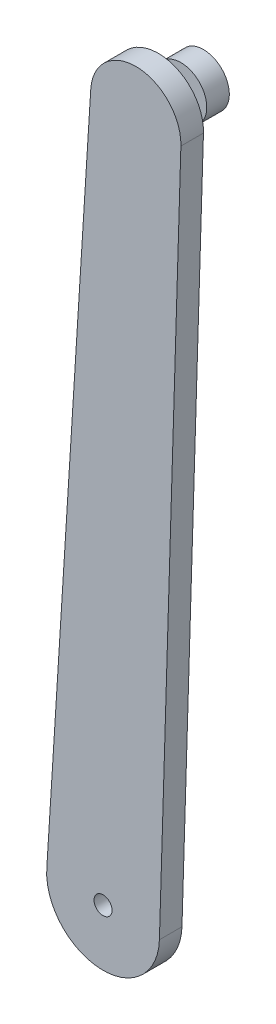
ISO-10303-21;
HEADER;
FILE_DESCRIPTION(('STEP AP214'),'2;1');
FILE_NAME('part.step','',(''),(''),'','','');
FILE_SCHEMA(('AUTOMOTIVE_DESIGN { 1 0 10303 214 1 1 1 1 }'));
ENDSEC;
DATA;
#1=APPLICATION_CONTEXT('core data for automotive mechanical design processes');
#2=APPLICATION_PROTOCOL_DEFINITION('international standard','automotive_design',2000,#1);
#3=PRODUCT_CONTEXT('',#1,'mechanical');
#4=PRODUCT('Part','Part','',(#3));
#5=PRODUCT_RELATED_PRODUCT_CATEGORY('part','',(#4));
#6=PRODUCT_DEFINITION_FORMATION('','',#4);
#7=PRODUCT_DEFINITION_CONTEXT('part definition',#1,'design');
#8=PRODUCT_DEFINITION('design','',#6,#7);
#9=PRODUCT_DEFINITION_SHAPE('','',#8);
#10=(LENGTH_UNIT() NAMED_UNIT(*) SI_UNIT(.MILLI.,.METRE.));
#11=(NAMED_UNIT(*) PLANE_ANGLE_UNIT() SI_UNIT($,.RADIAN.));
#12=(NAMED_UNIT(*) SI_UNIT($,.STERADIAN.) SOLID_ANGLE_UNIT());
#13=UNCERTAINTY_MEASURE_WITH_UNIT(LENGTH_MEASURE(1.E-05),#10,'distance_accuracy_value','');
#14=(GEOMETRIC_REPRESENTATION_CONTEXT(3) GLOBAL_UNCERTAINTY_ASSIGNED_CONTEXT((#13)) GLOBAL_UNIT_ASSIGNED_CONTEXT((#10,
#11,#12)) REPRESENTATION_CONTEXT('',''));
#15=CARTESIAN_POINT('',(0.,0.,0.));
#16=DIRECTION('',(0.,0.,1.));
#17=DIRECTION('',(1.,0.,0.));
#18=AXIS2_PLACEMENT_3D('',#15,#16,#17);
#19=CARTESIAN_POINT('',(15.5416799993005,-0.981251632451746,260.964116371449));
#20=DIRECTION('',(0.998012812603553,-0.0630113154849549,-1.64737168290973E-12));
#21=DIRECTION('',(0.0630113154849549,0.998012812603553,0.));
#22=AXIS2_PLACEMENT_3D('',#19,#20,#21);
#23=PLANE('',#22);
#24=DIRECTION('',(-0.0630113154849549,-0.998012812603553,1.04018967755278E-13));
#25=VECTOR('',#24,1.);
#26=CARTESIAN_POINT('',(15.5416799992963,-0.981251632451746,258.424116371449));
#27=LINE('',#26,#25);
#28=CARTESIAN_POINT('',(20.5840949122731,78.8836845442195,258.424116371441));
#29=VERTEX_POINT('',#28);
#30=CARTESIAN_POINT('',(15.6288954733021,0.400121853329466,258.424116371449));
#31=VERTEX_POINT('',#30);
#32=EDGE_CURVE('E115',#29,#31,#27,.T.);
#33=ORIENTED_EDGE('',*,*,#32,.T.);
#34=DIRECTION('',(-1.65065183743707E-12,0.,-1.));
#35=VECTOR('',#34,1.);
#36=CARTESIAN_POINT('',(15.6288954733063,0.400121853329466,260.964116371449));
#37=LINE('',#36,#35);
#38=CARTESIAN_POINT('',(15.6288954733063,0.400121853329466,260.964116371449));
#39=VERTEX_POINT('',#38);
#40=EDGE_CURVE('E48',#39,#31,#37,.T.);
#41=ORIENTED_EDGE('',*,*,#40,.F.);
#42=DIRECTION('',(-0.0630113154849549,-0.998012812603553,1.04018967755278E-13));
#43=VECTOR('',#42,1.);
#44=CARTESIAN_POINT('',(15.5416799993005,-0.981251632451746,260.964116371449));
#45=LINE('',#44,#43);
#46=CARTESIAN_POINT('',(20.5840949122772,78.8836845442195,260.964116371441));
#47=VERTEX_POINT('',#46);
#48=EDGE_CURVE('E99',#47,#39,#45,.T.);
#49=ORIENTED_EDGE('',*,*,#48,.F.);
#50=DIRECTION('',(-1.65065183743707E-12,0.,-1.));
#51=VECTOR('',#50,1.);
#52=CARTESIAN_POINT('',(20.5840949122772,78.8836845442195,260.964116371441));
#53=LINE('',#52,#51);
#54=EDGE_CURVE('E114',#47,#29,#53,.T.);
#55=ORIENTED_EDGE('',*,*,#54,.T.);
#56=EDGE_LOOP('',(#33,#41,#49,#55));
#57=FACE_BOUND('',#56,.T.);
#58=ADVANCED_FACE('F45',(#57),#23,.F.);
#59=CARTESIAN_POINT('',(21.9662768333389,0.,260.964116371438));
#60=DIRECTION('',(-1.65065183743707E-12,0.,-1.));
#61=DIRECTION('',(-1.,0.,1.65065183743707E-12));
#62=AXIS2_PLACEMENT_3D('',#59,#60,#61);
#63=CYLINDRICAL_SURFACE('',#62,6.35);
#64=CARTESIAN_POINT('',(21.9662768333347,0.,258.424116371438));
#65=DIRECTION('',(1.65079822496507E-12,0.,1.));
#66=DIRECTION('',(1.,0.,-1.65079822496507E-12));
#67=AXIS2_PLACEMENT_3D('',#64,#65,#66);
#68=CIRCLE('',#67,6.35);
#69=CARTESIAN_POINT('',(28.3132735924849,-0.195274523009568,258.424116371428));
#70=VERTEX_POINT('',#69);
#71=EDGE_CURVE('E104',#31,#70,#68,.T.);
#72=ORIENTED_EDGE('',*,*,#71,.T.);
#73=DIRECTION('',(-1.65065183743707E-12,0.,-1.));
#74=VECTOR('',#73,1.);
#75=CARTESIAN_POINT('',(28.3132735924891,-0.195274523009568,260.964116371428));
#76=LINE('',#75,#74);
#77=CARTESIAN_POINT('',(28.3132735924891,-0.195274523009568,260.964116371428));
#78=VERTEX_POINT('',#77);
#79=EDGE_CURVE('E102',#78,#70,#76,.T.);
#80=ORIENTED_EDGE('',*,*,#79,.F.);
#81=CARTESIAN_POINT('',(21.9662768333389,0.,260.964116371438));
#82=DIRECTION('',(1.65079822496507E-12,0.,1.));
#83=DIRECTION('',(1.,0.,-1.65079822496507E-12));
#84=AXIS2_PLACEMENT_3D('',#81,#82,#83);
#85=CIRCLE('',#84,6.35);
#86=EDGE_CURVE('E93',#39,#78,#85,.T.);
#87=ORIENTED_EDGE('',*,*,#86,.F.);
#88=ORIENTED_EDGE('',*,*,#40,.T.);
#89=EDGE_LOOP('',(#72,#80,#87,#88));
#90=FACE_BOUND('',#89,.T.);
#91=ADVANCED_FACE('F103',(#90),#63,.T.);
#92=CARTESIAN_POINT('',(28.2925005469463,-0.870459645501462,260.964116371428));
#93=DIRECTION('',(-0.999527048685074,0.030751893387334,1.64987115948004E-12));
#94=DIRECTION('',(-0.030751893387334,-0.999527048685074,0.));
#95=AXIS2_PLACEMENT_3D('',#92,#93,#94);
#96=PLANE('',#95);
#97=DIRECTION('',(0.030751893387334,0.999527048685074,0.));
#98=VECTOR('',#97,1.);
#99=CARTESIAN_POINT('',(28.2925005469421,-0.870459645501462,258.424116371428));
#100=LINE('',#99,#98);
#101=CARTESIAN_POINT('',(30.7315974076193,78.4073674431483,258.424116371424));
#102=VERTEX_POINT('',#101);
#103=EDGE_CURVE('E79',#70,#102,#100,.T.);
#104=ORIENTED_EDGE('',*,*,#103,.T.);
#105=DIRECTION('',(-1.65065183743707E-12,0.,-1.));
#106=VECTOR('',#105,1.);
#107=CARTESIAN_POINT('',(30.7315974076235,78.4073674431483,260.964116371424));
#108=LINE('',#107,#106);
#109=CARTESIAN_POINT('',(30.7315974076235,78.4073674431483,260.964116371424));
#110=VERTEX_POINT('',#109);
#111=EDGE_CURVE('E105',#110,#102,#108,.T.);
#112=ORIENTED_EDGE('',*,*,#111,.F.);
#113=DIRECTION('',(0.030751893387334,0.999527048685074,0.));
#114=VECTOR('',#113,1.);
#115=CARTESIAN_POINT('',(28.2925005469463,-0.870459645501462,260.964116371428));
#116=LINE('',#115,#114);
#117=EDGE_CURVE('E97',#78,#110,#116,.T.);
#118=ORIENTED_EDGE('',*,*,#117,.F.);
#119=ORIENTED_EDGE('',*,*,#79,.T.);
#120=EDGE_LOOP('',(#104,#112,#118,#119));
#121=FACE_BOUND('',#120,.T.);
#122=ADVANCED_FACE('F106',(#121),#96,.F.);
#123=CARTESIAN_POINT('',(25.6540000003033,78.5635870615559,260.964116371432));
#124=DIRECTION('',(-1.65065183743707E-12,0.,-1.));
#125=DIRECTION('',(-1.,0.,1.65065183743707E-12));
#126=AXIS2_PLACEMENT_3D('',#123,#124,#125);
#127=CYLINDRICAL_SURFACE('',#126,5.08);
#128=CARTESIAN_POINT('',(25.6540000002991,78.5635870615559,258.424116371432));
#129=DIRECTION('',(1.65079822496507E-12,0.,1.));
#130=DIRECTION('',(1.,0.,-1.65079822496507E-12));
#131=AXIS2_PLACEMENT_3D('',#128,#129,#130);
#132=CIRCLE('',#131,5.08);
#133=EDGE_CURVE('E85',#102,#29,#132,.T.);
#134=ORIENTED_EDGE('',*,*,#133,.T.);
#135=ORIENTED_EDGE('',*,*,#54,.F.);
#136=CARTESIAN_POINT('',(25.6540000003033,78.5635870615559,260.964116371432));
#137=DIRECTION('',(1.65079822496507E-12,0.,1.));
#138=DIRECTION('',(1.,0.,-1.65079822496507E-12));
#139=AXIS2_PLACEMENT_3D('',#136,#137,#138);
#140=CIRCLE('',#139,5.08);
#141=EDGE_CURVE('E62',#110,#47,#140,.T.);
#142=ORIENTED_EDGE('',*,*,#141,.F.);
#143=ORIENTED_EDGE('',*,*,#111,.T.);
#144=EDGE_LOOP('',(#134,#135,#142,#143));
#145=FACE_BOUND('',#144,.T.);
#146=ADVANCED_FACE('F126',(#145),#127,.T.);
#147=CARTESIAN_POINT('',(21.9662768333389,0.,260.964116371438));
#148=DIRECTION('',(-1.65065183743707E-12,0.,-1.));
#149=DIRECTION('',(-1.,0.,1.65065183743707E-12));
#150=AXIS2_PLACEMENT_3D('',#147,#148,#149);
#151=CYLINDRICAL_SURFACE('',#150,1.016);
#152=CARTESIAN_POINT('',(21.9662768333389,0.,260.964116371438));
#153=DIRECTION('',(1.65079822496507E-12,0.,1.));
#154=DIRECTION('',(1.,0.,-1.65079822496507E-12));
#155=AXIS2_PLACEMENT_3D('',#152,#153,#154);
#156=CIRCLE('',#155,1.016);
#157=CARTESIAN_POINT('',(22.9822768333389,0.,260.964116371437));
#158=VERTEX_POINT('',#157);
#159=EDGE_CURVE('E108',#158,#158,#156,.T.);
#160=ORIENTED_EDGE('',*,*,#159,.T.);
#161=EDGE_LOOP('',(#160));
#162=FACE_BOUND('',#161,.T.);
#163=CARTESIAN_POINT('',(21.9662768333347,0.,258.424116371438));
#164=DIRECTION('',(1.65079822496507E-12,0.,1.));
#165=DIRECTION('',(1.,0.,-1.65079822496507E-12));
#166=AXIS2_PLACEMENT_3D('',#163,#164,#165);
#167=CIRCLE('',#166,1.016);
#168=CARTESIAN_POINT('',(22.9822768333347,0.,258.424116371437));
#169=VERTEX_POINT('',#168);
#170=EDGE_CURVE('E122',#169,#169,#167,.T.);
#171=ORIENTED_EDGE('',*,*,#170,.F.);
#172=EDGE_LOOP('',(#171));
#173=FACE_BOUND('',#172,.T.);
#174=ADVANCED_FACE('F173',(#162,#173),#151,.F.);
#175=CARTESIAN_POINT('',(4.30797758577128E-10,0.,260.964116371475));
#176=DIRECTION('',(1.65079822496507E-12,0.,1.));
#177=DIRECTION('',(1.,0.,-1.65079822496507E-12));
#178=AXIS2_PLACEMENT_3D('',#175,#176,#177);
#179=PLANE('',#178);
#180=ORIENTED_EDGE('',*,*,#48,.T.);
#181=ORIENTED_EDGE('',*,*,#86,.T.);
#182=ORIENTED_EDGE('',*,*,#117,.T.);
#183=ORIENTED_EDGE('',*,*,#141,.T.);
#184=EDGE_LOOP('',(#180,#181,#182,#183));
#185=FACE_BOUND('',#184,.T.);
#186=ORIENTED_EDGE('',*,*,#159,.F.);
#187=EDGE_LOOP('',(#186));
#188=FACE_BOUND('',#187,.T.);
#189=ADVANCED_FACE('F94',(#185,#188),#179,.T.);
#190=CARTESIAN_POINT('',(4.26606666659168E-10,0.,258.424116371475));
#191=DIRECTION('',(1.65079822496507E-12,0.,1.));
#192=DIRECTION('',(1.,0.,-1.65079822496507E-12));
#193=AXIS2_PLACEMENT_3D('',#190,#191,#192);
#194=PLANE('',#193);
#195=CARTESIAN_POINT('',(25.6540000002991,78.5635870615559,258.424116371432));
#196=DIRECTION('',(-1.65079822496507E-12,0.,-1.));
#197=DIRECTION('',(-1.,0.,1.65079822496507E-12));
#198=AXIS2_PLACEMENT_3D('',#195,#196,#197);
#199=CIRCLE('',#198,1.01599999999998);
#200=CARTESIAN_POINT('',(24.6380000002991,78.5635870615559,258.424116371434));
#201=VERTEX_POINT('',#200);
#202=EDGE_CURVE('E11',#201,#201,#199,.T.);
#203=ORIENTED_EDGE('',*,*,#202,.F.);
#204=EDGE_LOOP('',(#203));
#205=FACE_BOUND('',#204,.T.);
#206=ORIENTED_EDGE('',*,*,#32,.F.);
#207=ORIENTED_EDGE('',*,*,#133,.F.);
#208=ORIENTED_EDGE('',*,*,#103,.F.);
#209=ORIENTED_EDGE('',*,*,#71,.F.);
#210=EDGE_LOOP('',(#206,#207,#208,#209));
#211=FACE_BOUND('',#210,.T.);
#212=ORIENTED_EDGE('',*,*,#170,.T.);
#213=EDGE_LOOP('',(#212));
#214=FACE_BOUND('',#213,.T.);
#215=ADVANCED_FACE('F129',(#205,#211,#214),#194,.F.);
#216=CARTESIAN_POINT('',(25.6540000002949,78.5635870615559,255.884116371432));
#217=DIRECTION('',(1.65079822496507E-12,0.,1.));
#218=DIRECTION('',(1.,0.,-1.65079822496507E-12));
#219=AXIS2_PLACEMENT_3D('',#216,#217,#218);
#220=CYLINDRICAL_SURFACE('',#219,1.01599999999998);
#221=CARTESIAN_POINT('',(25.6540000002949,78.5635870615559,255.884116371432));
#222=DIRECTION('',(-1.65079822496507E-12,0.,-1.));
#223=DIRECTION('',(-1.,0.,1.65079822496507E-12));
#224=AXIS2_PLACEMENT_3D('',#221,#222,#223);
#225=CIRCLE('',#224,1.01599999999998);
#226=CARTESIAN_POINT('',(24.6380000002949,78.5635870615559,255.884116371434));
#227=VERTEX_POINT('',#226);
#228=EDGE_CURVE('E118',#227,#227,#225,.T.);
#229=ORIENTED_EDGE('',*,*,#228,.F.);
#230=EDGE_LOOP('',(#229));
#231=FACE_BOUND('',#230,.T.);
#232=ORIENTED_EDGE('',*,*,#202,.T.);
#233=EDGE_LOOP('',(#232));
#234=FACE_BOUND('',#233,.T.);
#235=ADVANCED_FACE('F147',(#231,#234),#220,.T.);
#236=CARTESIAN_POINT('',(25.6540000002907,78.5635870615559,253.344116371432));
#237=DIRECTION('',(1.65079822496507E-12,0.,1.));
#238=DIRECTION('',(1.,0.,-1.65079822496507E-12));
#239=AXIS2_PLACEMENT_3D('',#236,#237,#238);
#240=CYLINDRICAL_SURFACE('',#239,2.90965416301473);
#241=CARTESIAN_POINT('',(25.6540000002907,78.5635870615559,253.344116371432));
#242=DIRECTION('',(-1.65079822496507E-12,0.,-1.));
#243=DIRECTION('',(-1.,0.,1.65079822496507E-12));
#244=AXIS2_PLACEMENT_3D('',#241,#242,#243);
#245=CIRCLE('',#244,2.90965416301473);
#246=CARTESIAN_POINT('',(22.744345837276,78.5635870615559,253.344116371437));
#247=VERTEX_POINT('',#246);
#248=EDGE_CURVE('E135',#247,#247,#245,.T.);
#249=ORIENTED_EDGE('',*,*,#248,.F.);
#250=EDGE_LOOP('',(#249));
#251=FACE_BOUND('',#250,.T.);
#252=CARTESIAN_POINT('',(25.6540000002949,78.5635870615559,255.884116371432));
#253=DIRECTION('',(-1.65079822496507E-12,0.,-1.));
#254=DIRECTION('',(-1.,0.,1.65079822496507E-12));
#255=AXIS2_PLACEMENT_3D('',#252,#253,#254);
#256=CIRCLE('',#255,2.90965416301473);
#257=CARTESIAN_POINT('',(22.7443458372802,78.5635870615559,255.884116371437));
#258=VERTEX_POINT('',#257);
#259=EDGE_CURVE('E136',#258,#258,#256,.T.);
#260=ORIENTED_EDGE('',*,*,#259,.T.);
#261=EDGE_LOOP('',(#260));
#262=FACE_BOUND('',#261,.T.);
#263=ADVANCED_FACE('F144',(#251,#262),#240,.T.);
#264=CARTESIAN_POINT('',(25.6540000002907,78.5635870615559,253.344116371432));
#265=DIRECTION('',(-1.65079822496507E-12,0.,-1.));
#266=DIRECTION('',(-1.,0.,1.65079822496507E-12));
#267=AXIS2_PLACEMENT_3D('',#264,#265,#266);
#268=PLANE('',#267);
#269=ORIENTED_EDGE('',*,*,#248,.T.);
#270=EDGE_LOOP('',(#269));
#271=FACE_BOUND('',#270,.T.);
#272=ADVANCED_FACE('F142',(#271),#268,.T.);
#273=CARTESIAN_POINT('',(25.6540000002949,78.5635870615559,255.884116371432));
#274=DIRECTION('',(-1.65079822496507E-12,0.,-1.));
#275=DIRECTION('',(-1.,0.,1.65079822496507E-12));
#276=AXIS2_PLACEMENT_3D('',#273,#274,#275);
#277=PLANE('',#276);
#278=ORIENTED_EDGE('',*,*,#228,.T.);
#279=EDGE_LOOP('',(#278));
#280=FACE_BOUND('',#279,.T.);
#281=ORIENTED_EDGE('',*,*,#259,.F.);
#282=EDGE_LOOP('',(#281));
#283=FACE_BOUND('',#282,.T.);
#284=ADVANCED_FACE('F151',(#280,#283),#277,.F.);
#285=CLOSED_SHELL('',(#58,#91,#122,#146,#174,#189,#215,#235,#263,#272,#284));
#286=MANIFOLD_SOLID_BREP('B2',#285);
#287=ADVANCED_BREP_SHAPE_REPRESENTATION('',(#18,#286),#14);
#288=SHAPE_DEFINITION_REPRESENTATION(#9,#287);
ENDSEC;
END-ISO-10303-21;
